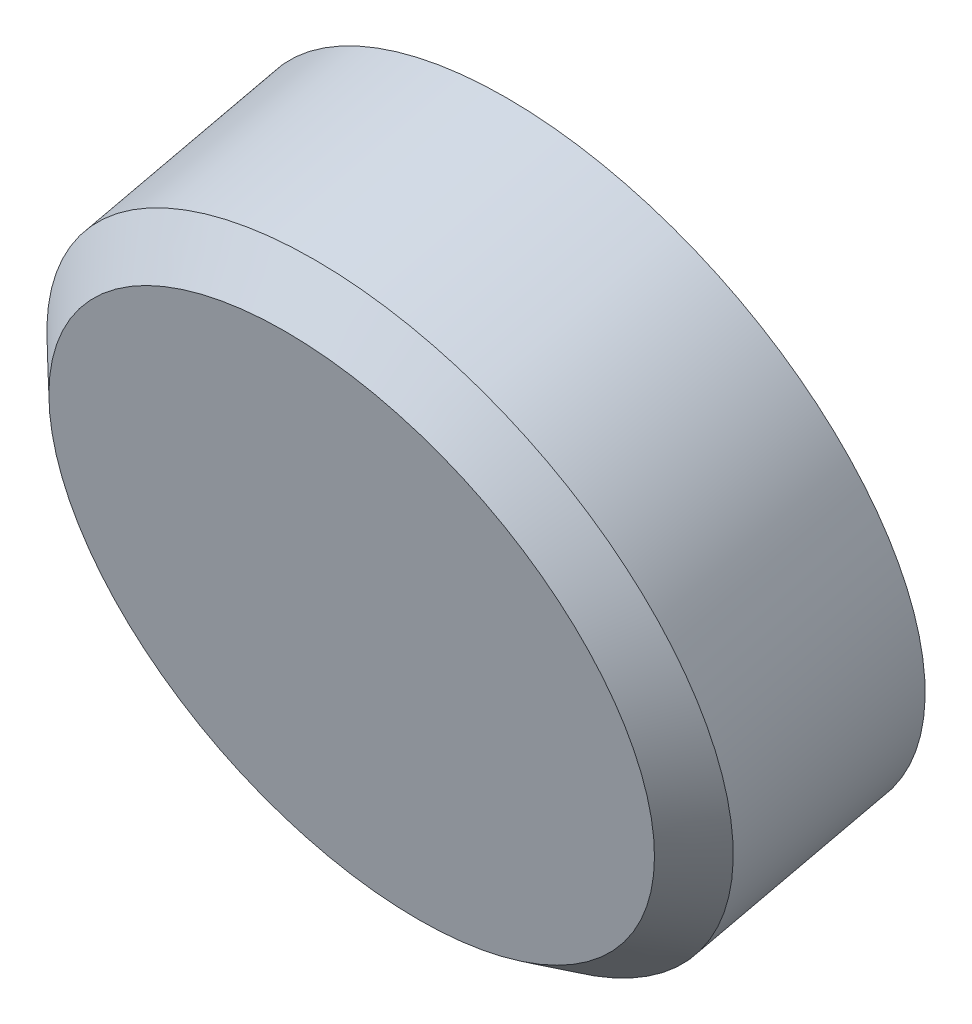
ISO-10303-21;
HEADER;
FILE_DESCRIPTION(('STEP AP214'),'2;1');
FILE_NAME('part.step','',(''),(''),'','','');
FILE_SCHEMA(('AUTOMOTIVE_DESIGN { 1 0 10303 214 1 1 1 1 }'));
ENDSEC;
DATA;
#1=APPLICATION_CONTEXT('core data for automotive mechanical design processes');
#2=APPLICATION_PROTOCOL_DEFINITION('international standard','automotive_design',2000,#1);
#3=PRODUCT_CONTEXT('',#1,'mechanical');
#4=PRODUCT('Part','Part','',(#3));
#5=PRODUCT_RELATED_PRODUCT_CATEGORY('part','',(#4));
#6=PRODUCT_DEFINITION_FORMATION('','',#4);
#7=PRODUCT_DEFINITION_CONTEXT('part definition',#1,'design');
#8=PRODUCT_DEFINITION('design','',#6,#7);
#9=PRODUCT_DEFINITION_SHAPE('','',#8);
#10=(LENGTH_UNIT() NAMED_UNIT(*) SI_UNIT(.MILLI.,.METRE.));
#11=(NAMED_UNIT(*) PLANE_ANGLE_UNIT() SI_UNIT($,.RADIAN.));
#12=(NAMED_UNIT(*) SI_UNIT($,.STERADIAN.) SOLID_ANGLE_UNIT());
#13=UNCERTAINTY_MEASURE_WITH_UNIT(LENGTH_MEASURE(1.E-05),#10,'distance_accuracy_value','');
#14=(GEOMETRIC_REPRESENTATION_CONTEXT(3) GLOBAL_UNCERTAINTY_ASSIGNED_CONTEXT((#13)) GLOBAL_UNIT_ASSIGNED_CONTEXT((#10,
#11,#12)) REPRESENTATION_CONTEXT('',''));
#15=CARTESIAN_POINT('',(0.,0.,0.));
#16=DIRECTION('',(0.,0.,1.));
#17=DIRECTION('',(1.,0.,0.));
#18=AXIS2_PLACEMENT_3D('',#15,#16,#17);
#19=CARTESIAN_POINT('',(4.24215403460223,-22.0762664904867,12.3182328112972));
#20=DIRECTION('',(0.,0.224951054343861,-0.974370064785236));
#21=DIRECTION('',(-1.,0.,0.));
#22=AXIS2_PLACEMENT_3D('',#19,#20,#21);
#23=PLANE('',#22);
#24=CARTESIAN_POINT('',(-0.0178459653977694,-17.9254500145016,13.2765243028021));
#25=DIRECTION('',(0.,0.224951054343856,-0.974370064785237));
#26=DIRECTION('',(0.,0.974370064785237,0.224951054343856));
#27=AXIS2_PLACEMENT_3D('',#24,#25,#26);
#28=CIRCLE('',#27,4.25000000000003);
#29=CARTESIAN_POINT('',(-0.0178459653977694,-13.7843772391643,14.2325662837635));
#30=VERTEX_POINT('',#29);
#31=EDGE_CURVE('E19',#30,#30,#28,.F.);
#32=ORIENTED_EDGE('',*,*,#31,.F.);
#33=EDGE_LOOP('',(#32));
#34=FACE_BOUND('',#33,.T.);
#35=ADVANCED_FACE('F15',(#34),#23,.T.);
#36=CARTESIAN_POINT('',(-3.77784596539777,-22.2639346211257,15.3538185328248));
#37=DIRECTION('',(0.,-0.224951054343869,0.974370064785234));
#38=DIRECTION('',(1.,0.,0.));
#39=AXIS2_PLACEMENT_3D('',#36,#37,#38);
#40=PLANE('',#39);
#41=CARTESIAN_POINT('',(-0.0178459653977716,-18.6003031775332,16.1996344971577));
#42=DIRECTION('',(0.,0.224951054343862,-0.974370064785236));
#43=DIRECTION('',(0.,0.974370064785236,0.224951054343862));
#44=AXIS2_PLACEMENT_3D('',#41,#42,#43);
#45=CIRCLE('',#44,3.74999999999997);
#46=CARTESIAN_POINT('',(-0.0178459653977716,-14.9464154345886,17.0432009509472));
#47=VERTEX_POINT('',#46);
#48=EDGE_CURVE('E23',#47,#47,#45,.T.);
#49=ORIENTED_EDGE('',*,*,#48,.F.);
#50=EDGE_LOOP('',(#49));
#51=FACE_BOUND('',#50,.T.);
#52=ADVANCED_FACE('F37',(#51),#40,.T.);
#53=CARTESIAN_POINT('',(-0.0178459653977699,-18.4878276503612,15.7124494647651));
#54=DIRECTION('',(0.,0.224951054343856,-0.974370064785237));
#55=DIRECTION('',(0.,0.974370064785237,0.224951054343856));
#56=AXIS2_PLACEMENT_3D('',#53,#54,#55);
#57=CYLINDRICAL_SURFACE('',#56,4.25000000000003);
#58=ORIENTED_EDGE('',*,*,#31,.T.);
#59=EDGE_LOOP('',(#58));
#60=FACE_BOUND('',#59,.T.);
#61=CARTESIAN_POINT('',(-0.0178459653977738,-18.4878276503612,15.7124494647651));
#62=DIRECTION('',(0.,-0.224951054343861,0.974370064785236));
#63=DIRECTION('',(0.,-0.974370064785236,-0.224951054343861));
#64=AXIS2_PLACEMENT_3D('',#61,#62,#63);
#65=CIRCLE('',#64,4.24999999999997);
#66=CARTESIAN_POINT('',(-0.0178459653977738,-22.6289004256984,14.7564074838037));
#67=VERTEX_POINT('',#66);
#68=EDGE_CURVE('E10',#67,#67,#65,.T.);
#69=ORIENTED_EDGE('',*,*,#68,.F.);
#70=EDGE_LOOP('',(#69));
#71=FACE_BOUND('',#70,.T.);
#72=ADVANCED_FACE('F33',(#60,#71),#57,.T.);
#73=CARTESIAN_POINT('',(-0.0178459653977716,-18.6003031775332,16.1996344971577));
#74=DIRECTION('',(0.,0.224951054343862,-0.974370064785236));
#75=DIRECTION('',(0.,0.974370064785236,0.224951054343862));
#76=AXIS2_PLACEMENT_3D('',#73,#74,#75);
#77=CONICAL_SURFACE('',#76,3.74999999999999,0.785398163397459);
#78=ORIENTED_EDGE('',*,*,#68,.T.);
#79=EDGE_LOOP('',(#78));
#80=FACE_BOUND('',#79,.T.);
#81=ORIENTED_EDGE('',*,*,#48,.T.);
#82=EDGE_LOOP('',(#81));
#83=FACE_BOUND('',#82,.T.);
#84=ADVANCED_FACE('F17',(#80,#83),#77,.T.);
#85=CLOSED_SHELL('',(#35,#52,#72,#84));
#86=MANIFOLD_SOLID_BREP('B1',#85);
#87=ADVANCED_BREP_SHAPE_REPRESENTATION('',(#18,#86),#14);
#88=SHAPE_DEFINITION_REPRESENTATION(#9,#87);
ENDSEC;
END-ISO-10303-21;
